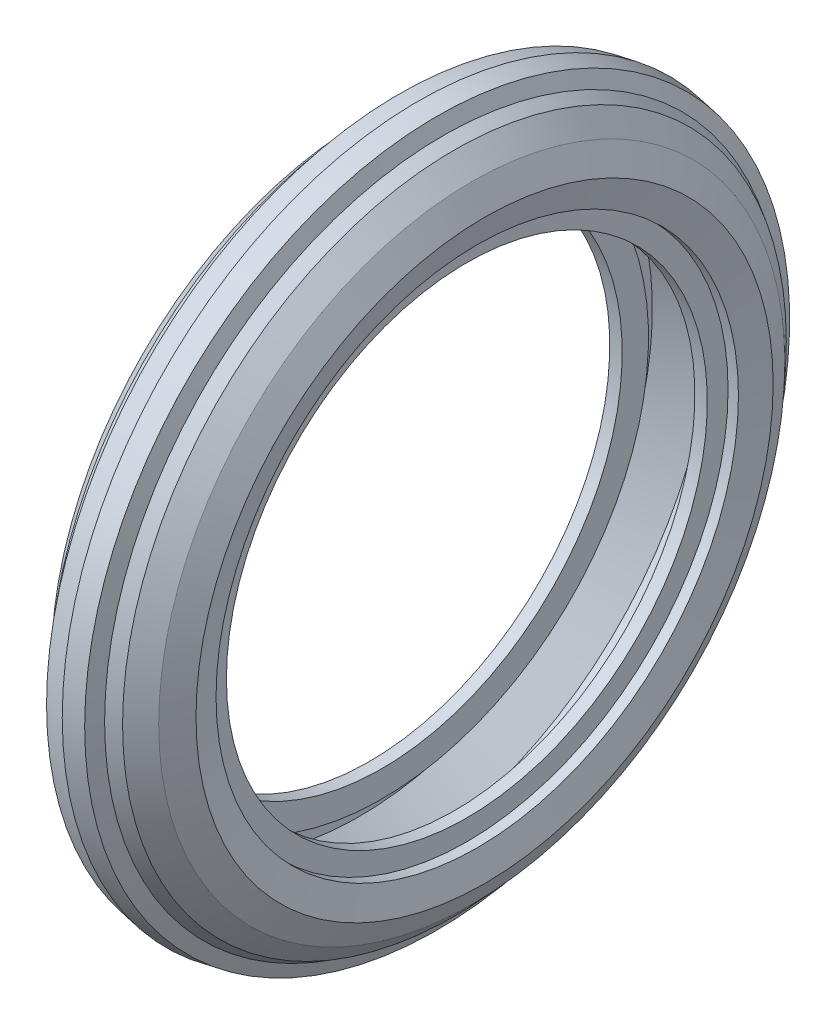
ISO-10303-21;
HEADER;
FILE_DESCRIPTION(('STEP AP214'),'2;1');
FILE_NAME('part.step','',(''),(''),'','','');
FILE_SCHEMA(('AUTOMOTIVE_DESIGN { 1 0 10303 214 1 1 1 1 }'));
ENDSEC;
DATA;
#1=APPLICATION_CONTEXT('core data for automotive mechanical design processes');
#2=APPLICATION_PROTOCOL_DEFINITION('international standard','automotive_design',2000,#1);
#3=PRODUCT_CONTEXT('',#1,'mechanical');
#4=PRODUCT('Part','Part','',(#3));
#5=PRODUCT_RELATED_PRODUCT_CATEGORY('part','',(#4));
#6=PRODUCT_DEFINITION_FORMATION('','',#4);
#7=PRODUCT_DEFINITION_CONTEXT('part definition',#1,'design');
#8=PRODUCT_DEFINITION('design','',#6,#7);
#9=PRODUCT_DEFINITION_SHAPE('','',#8);
#10=(LENGTH_UNIT() NAMED_UNIT(*) SI_UNIT(.MILLI.,.METRE.));
#11=(NAMED_UNIT(*) PLANE_ANGLE_UNIT() SI_UNIT($,.RADIAN.));
#12=(NAMED_UNIT(*) SI_UNIT($,.STERADIAN.) SOLID_ANGLE_UNIT());
#13=UNCERTAINTY_MEASURE_WITH_UNIT(LENGTH_MEASURE(1.E-05),#10,'distance_accuracy_value','');
#14=(GEOMETRIC_REPRESENTATION_CONTEXT(3) GLOBAL_UNCERTAINTY_ASSIGNED_CONTEXT((#13)) GLOBAL_UNIT_ASSIGNED_CONTEXT((#10,
#11,#12)) REPRESENTATION_CONTEXT('',''));
#15=CARTESIAN_POINT('',(0.,0.,0.));
#16=DIRECTION('',(0.,0.,1.));
#17=DIRECTION('',(1.,0.,0.));
#18=AXIS2_PLACEMENT_3D('',#15,#16,#17);
#19=CARTESIAN_POINT('',(-4.04774100981548,0.,0.));
#20=DIRECTION('',(1.,0.,0.));
#21=DIRECTION('',(0.,0.,-1.));
#22=AXIS2_PLACEMENT_3D('',#19,#20,#21);
#23=CONICAL_SURFACE('',#22,46.5793784236157,0.27008635387307);
#24=CARTESIAN_POINT('',(0.,0.,0.));
#25=DIRECTION('',(-1.,0.,0.));
#26=DIRECTION('',(0.,0.,1.));
#27=AXIS2_PLACEMENT_3D('',#24,#25,#26);
#28=CIRCLE('',#27,47.7);
#29=CARTESIAN_POINT('',(0.,0.,47.7));
#30=VERTEX_POINT('',#29);
#31=EDGE_CURVE('E140',#30,#30,#28,.T.);
#32=ORIENTED_EDGE('',*,*,#31,.F.);
#33=EDGE_LOOP('',(#32));
#34=FACE_BOUND('',#33,.T.);
#35=CARTESIAN_POINT('',(-4.04774100981548,0.,0.));
#36=DIRECTION('',(-1.,0.,0.));
#37=DIRECTION('',(0.,0.,1.));
#38=AXIS2_PLACEMENT_3D('',#35,#36,#37);
#39=CIRCLE('',#38,46.5793784236157);
#40=CARTESIAN_POINT('',(-4.04774100981548,0.,46.5793784236157));
#41=VERTEX_POINT('',#40);
#42=EDGE_CURVE('E10',#41,#41,#39,.T.);
#43=ORIENTED_EDGE('',*,*,#42,.T.);
#44=EDGE_LOOP('',(#43));
#45=FACE_BOUND('',#44,.T.);
#46=ADVANCED_FACE('F36',(#34,#45),#23,.F.);
#47=CARTESIAN_POINT('',(-8.49102763034936,0.,0.));
#48=DIRECTION('',(1.,0.,0.));
#49=DIRECTION('',(0.,0.,-1.));
#50=AXIS2_PLACEMENT_3D('',#47,#48,#49);
#51=CONICAL_SURFACE('',#50,42.4,0.754801377287533);
#52=ORIENTED_EDGE('',*,*,#42,.F.);
#53=EDGE_LOOP('',(#52));
#54=FACE_BOUND('',#53,.T.);
#55=CARTESIAN_POINT('',(-8.49102763034936,0.,0.));
#56=DIRECTION('',(-1.,0.,0.));
#57=DIRECTION('',(0.,0.,1.));
#58=AXIS2_PLACEMENT_3D('',#55,#56,#57);
#59=CIRCLE('',#58,42.4);
#60=CARTESIAN_POINT('',(-8.49102763034936,0.,42.4));
#61=VERTEX_POINT('',#60);
#62=EDGE_CURVE('E43',#61,#61,#59,.T.);
#63=ORIENTED_EDGE('',*,*,#62,.T.);
#64=EDGE_LOOP('',(#63));
#65=FACE_BOUND('',#64,.T.);
#66=ADVANCED_FACE('F148',(#54,#65),#51,.F.);
#67=CARTESIAN_POINT('',(-8.49102763034935,42.4,0.));
#68=DIRECTION('',(-1.,0.,0.));
#69=DIRECTION('',(0.,0.,1.));
#70=AXIS2_PLACEMENT_3D('',#67,#68,#69);
#71=PLANE('',#70);
#72=ORIENTED_EDGE('',*,*,#62,.F.);
#73=EDGE_LOOP('',(#72));
#74=FACE_BOUND('',#73,.T.);
#75=CARTESIAN_POINT('',(-8.49102763034934,0.,0.));
#76=DIRECTION('',(-1.,0.,0.));
#77=DIRECTION('',(0.,0.,1.));
#78=AXIS2_PLACEMENT_3D('',#75,#76,#77);
#79=CIRCLE('',#78,40.4);
#80=CARTESIAN_POINT('',(-8.49102763034934,0.,40.4));
#81=VERTEX_POINT('',#80);
#82=EDGE_CURVE('E50',#81,#81,#79,.T.);
#83=ORIENTED_EDGE('',*,*,#82,.T.);
#84=EDGE_LOOP('',(#83));
#85=FACE_BOUND('',#84,.T.);
#86=ADVANCED_FACE('F152',(#74,#85),#71,.F.);
#87=CARTESIAN_POINT('',(-5.25838165530042,0.,0.));
#88=DIRECTION('',(-1.,0.,0.));
#89=DIRECTION('',(0.,0.,1.));
#90=AXIS2_PLACEMENT_3D('',#87,#88,#89);
#91=CONICAL_SURFACE('',#90,38.6,0.508063755956606);
#92=ORIENTED_EDGE('',*,*,#82,.F.);
#93=EDGE_LOOP('',(#92));
#94=FACE_BOUND('',#93,.T.);
#95=CARTESIAN_POINT('',(-5.25838165530042,0.,0.));
#96=DIRECTION('',(-1.,0.,0.));
#97=DIRECTION('',(0.,0.,1.));
#98=AXIS2_PLACEMENT_3D('',#95,#96,#97);
#99=CIRCLE('',#98,38.6);
#100=CARTESIAN_POINT('',(-5.25838165530042,0.,38.6));
#101=VERTEX_POINT('',#100);
#102=EDGE_CURVE('E56',#101,#101,#99,.T.);
#103=ORIENTED_EDGE('',*,*,#102,.T.);
#104=EDGE_LOOP('',(#103));
#105=FACE_BOUND('',#104,.T.);
#106=ADVANCED_FACE('F157',(#94,#105),#91,.T.);
#107=CARTESIAN_POINT('',(-5.25838165530042,38.6,0.));
#108=DIRECTION('',(-1.,0.,0.));
#109=DIRECTION('',(0.,0.,1.));
#110=AXIS2_PLACEMENT_3D('',#107,#108,#109);
#111=PLANE('',#110);
#112=ORIENTED_EDGE('',*,*,#102,.F.);
#113=EDGE_LOOP('',(#112));
#114=FACE_BOUND('',#113,.T.);
#115=CARTESIAN_POINT('',(-5.25838165530043,0.,0.));
#116=DIRECTION('',(-1.,0.,0.));
#117=DIRECTION('',(0.,0.,1.));
#118=AXIS2_PLACEMENT_3D('',#115,#116,#117);
#119=CIRCLE('',#118,34.8);
#120=CARTESIAN_POINT('',(-5.25838165530043,0.,34.8));
#121=VERTEX_POINT('',#120);
#122=EDGE_CURVE('E61',#121,#121,#119,.T.);
#123=ORIENTED_EDGE('',*,*,#122,.T.);
#124=EDGE_LOOP('',(#123));
#125=FACE_BOUND('',#124,.T.);
#126=ADVANCED_FACE('F163',(#114,#125),#111,.F.);
#127=CARTESIAN_POINT('',(0.,0.,0.));
#128=DIRECTION('',(-1.,0.,0.));
#129=DIRECTION('',(0.,0.,1.));
#130=AXIS2_PLACEMENT_3D('',#127,#128,#129);
#131=CYLINDRICAL_SURFACE('',#130,34.8);
#132=ORIENTED_EDGE('',*,*,#122,.F.);
#133=EDGE_LOOP('',(#132));
#134=FACE_BOUND('',#133,.T.);
#135=CARTESIAN_POINT('',(-7.05838165530042,0.,0.));
#136=DIRECTION('',(-1.,0.,0.));
#137=DIRECTION('',(0.,0.,1.));
#138=AXIS2_PLACEMENT_3D('',#135,#136,#137);
#139=CIRCLE('',#138,34.8);
#140=CARTESIAN_POINT('',(-7.05838165530042,0.,34.8));
#141=VERTEX_POINT('',#140);
#142=EDGE_CURVE('E64',#141,#141,#139,.T.);
#143=ORIENTED_EDGE('',*,*,#142,.T.);
#144=EDGE_LOOP('',(#143));
#145=FACE_BOUND('',#144,.T.);
#146=ADVANCED_FACE('F167',(#134,#145),#131,.F.);
#147=CARTESIAN_POINT('',(-7.05838165530042,34.8,0.));
#148=DIRECTION('',(1.,0.,0.));
#149=DIRECTION('',(0.,0.,-1.));
#150=AXIS2_PLACEMENT_3D('',#147,#148,#149);
#151=PLANE('',#150);
#152=ORIENTED_EDGE('',*,*,#142,.F.);
#153=EDGE_LOOP('',(#152));
#154=FACE_BOUND('',#153,.T.);
#155=CARTESIAN_POINT('',(-7.05838165530042,0.,0.));
#156=DIRECTION('',(-1.,0.,0.));
#157=DIRECTION('',(0.,0.,1.));
#158=AXIS2_PLACEMENT_3D('',#155,#156,#157);
#159=CIRCLE('',#158,37.8);
#160=CARTESIAN_POINT('',(-7.05838165530042,0.,37.8));
#161=VERTEX_POINT('',#160);
#162=EDGE_CURVE('E67',#161,#161,#159,.T.);
#163=ORIENTED_EDGE('',*,*,#162,.T.);
#164=EDGE_LOOP('',(#163));
#165=FACE_BOUND('',#164,.T.);
#166=ADVANCED_FACE('F171',(#154,#165),#151,.F.);
#167=CARTESIAN_POINT('',(0.,0.,0.));
#168=DIRECTION('',(-1.,0.,0.));
#169=DIRECTION('',(0.,0.,1.));
#170=AXIS2_PLACEMENT_3D('',#167,#168,#169);
#171=CYLINDRICAL_SURFACE('',#170,37.8);
#172=ORIENTED_EDGE('',*,*,#162,.F.);
#173=EDGE_LOOP('',(#172));
#174=FACE_BOUND('',#173,.T.);
#175=CARTESIAN_POINT('',(-8.55838165530042,0.,0.));
#176=DIRECTION('',(-1.,0.,0.));
#177=DIRECTION('',(0.,0.,1.));
#178=AXIS2_PLACEMENT_3D('',#175,#176,#177);
#179=CIRCLE('',#178,37.8);
#180=CARTESIAN_POINT('',(-8.55838165530042,0.,37.8));
#181=VERTEX_POINT('',#180);
#182=EDGE_CURVE('E70',#181,#181,#179,.T.);
#183=ORIENTED_EDGE('',*,*,#182,.T.);
#184=EDGE_LOOP('',(#183));
#185=FACE_BOUND('',#184,.T.);
#186=ADVANCED_FACE('F175',(#174,#185),#171,.F.);
#187=CARTESIAN_POINT('',(-9.61933982850798,0.,0.));
#188=DIRECTION('',(-1.,0.,0.));
#189=DIRECTION('',(0.,0.,1.));
#190=AXIS2_PLACEMENT_3D('',#187,#188,#189);
#191=CONICAL_SURFACE('',#190,41.7603494485593,1.30904741763839);
#192=ORIENTED_EDGE('',*,*,#182,.F.);
#193=EDGE_LOOP('',(#192));
#194=FACE_BOUND('',#193,.T.);
#195=CARTESIAN_POINT('',(-9.61933982850798,0.,0.));
#196=DIRECTION('',(-1.,0.,0.));
#197=DIRECTION('',(0.,0.,1.));
#198=AXIS2_PLACEMENT_3D('',#195,#196,#197);
#199=CIRCLE('',#198,41.7603494485593);
#200=CARTESIAN_POINT('',(-9.61933982850798,0.,41.7603494485593));
#201=VERTEX_POINT('',#200);
#202=EDGE_CURVE('E73',#201,#201,#199,.T.);
#203=ORIENTED_EDGE('',*,*,#202,.T.);
#204=EDGE_LOOP('',(#203));
#205=FACE_BOUND('',#204,.T.);
#206=ADVANCED_FACE('F179',(#194,#205),#191,.F.);
#207=CARTESIAN_POINT('',(-7.76051889287042,0.,0.));
#208=DIRECTION('',(1.,0.,0.));
#209=DIRECTION('',(0.,0.,-1.));
#210=AXIS2_PLACEMENT_3D('',#207,#208,#209);
#211=CONICAL_SURFACE('',#210,45.3022112088819,1.08749463862053);
#212=ORIENTED_EDGE('',*,*,#202,.F.);
#213=EDGE_LOOP('',(#212));
#214=FACE_BOUND('',#213,.T.);
#215=CARTESIAN_POINT('',(-7.76051889287042,0.,0.));
#216=DIRECTION('',(-1.,0.,0.));
#217=DIRECTION('',(0.,0.,1.));
#218=AXIS2_PLACEMENT_3D('',#215,#216,#217);
#219=CIRCLE('',#218,45.3022112088819);
#220=CARTESIAN_POINT('',(-7.76051889287042,0.,45.3022112088819));
#221=VERTEX_POINT('',#220);
#222=EDGE_CURVE('E76',#221,#221,#219,.T.);
#223=ORIENTED_EDGE('',*,*,#222,.T.);
#224=EDGE_LOOP('',(#223));
#225=FACE_BOUND('',#224,.T.);
#226=ADVANCED_FACE('F183',(#214,#225),#211,.T.);
#227=CARTESIAN_POINT('',(-5.25838165530043,0.,0.));
#228=DIRECTION('',(1.,0.,0.));
#229=DIRECTION('',(0.,0.,-1.));
#230=AXIS2_PLACEMENT_3D('',#227,#228,#229);
#231=CONICAL_SURFACE('',#230,48.0278871331924,0.828131633697217);
#232=ORIENTED_EDGE('',*,*,#222,.F.);
#233=EDGE_LOOP('',(#232));
#234=FACE_BOUND('',#233,.T.);
#235=CARTESIAN_POINT('',(-5.25838165530043,0.,0.));
#236=DIRECTION('',(-1.,0.,0.));
#237=DIRECTION('',(0.,0.,1.));
#238=AXIS2_PLACEMENT_3D('',#235,#236,#237);
#239=CIRCLE('',#238,48.0278871331924);
#240=CARTESIAN_POINT('',(-5.25838165530043,0.,48.0278871331924));
#241=VERTEX_POINT('',#240);
#242=EDGE_CURVE('E80',#241,#241,#239,.T.);
#243=ORIENTED_EDGE('',*,*,#242,.T.);
#244=EDGE_LOOP('',(#243));
#245=FACE_BOUND('',#244,.T.);
#246=ADVANCED_FACE('F187',(#234,#245),#231,.T.);
#247=CARTESIAN_POINT('',(-3.61929083035339,0.,0.));
#248=DIRECTION('',(1.,0.,0.));
#249=DIRECTION('',(0.,0.,-1.));
#250=AXIS2_PLACEMENT_3D('',#247,#248,#249);
#251=CONICAL_SURFACE('',#250,48.988814428868,0.530252528258391);
#252=ORIENTED_EDGE('',*,*,#242,.F.);
#253=EDGE_LOOP('',(#252));
#254=FACE_BOUND('',#253,.T.);
#255=CARTESIAN_POINT('',(-3.61929083035339,0.,0.));
#256=DIRECTION('',(-1.,0.,0.));
#257=DIRECTION('',(0.,0.,1.));
#258=AXIS2_PLACEMENT_3D('',#255,#256,#257);
#259=CIRCLE('',#258,48.988814428868);
#260=CARTESIAN_POINT('',(-3.61929083035339,0.,48.988814428868));
#261=VERTEX_POINT('',#260);
#262=EDGE_CURVE('E84',#261,#261,#259,.T.);
#263=ORIENTED_EDGE('',*,*,#262,.T.);
#264=EDGE_LOOP('',(#263));
#265=FACE_BOUND('',#264,.T.);
#266=ADVANCED_FACE('F191',(#254,#265),#251,.T.);
#267=CARTESIAN_POINT('',(-2.75730827300353,0.,0.));
#268=DIRECTION('',(1.,0.,0.));
#269=DIRECTION('',(0.,0.,-1.));
#270=AXIS2_PLACEMENT_3D('',#267,#268,#269);
#271=CONICAL_SURFACE('',#270,51.0129157284142,1.16819798825675);
#272=ORIENTED_EDGE('',*,*,#262,.F.);
#273=EDGE_LOOP('',(#272));
#274=FACE_BOUND('',#273,.T.);
#275=CARTESIAN_POINT('',(-2.75730827300353,0.,0.));
#276=DIRECTION('',(-1.,0.,0.));
#277=DIRECTION('',(0.,0.,1.));
#278=AXIS2_PLACEMENT_3D('',#275,#276,#277);
#279=CIRCLE('',#278,51.0129157284142);
#280=CARTESIAN_POINT('',(-2.75730827300353,0.,51.0129157284142));
#281=VERTEX_POINT('',#280);
#282=EDGE_CURVE('E87',#281,#281,#279,.T.);
#283=ORIENTED_EDGE('',*,*,#282,.T.);
#284=EDGE_LOOP('',(#283));
#285=FACE_BOUND('',#284,.T.);
#286=ADVANCED_FACE('F195',(#274,#285),#271,.T.);
#287=CARTESIAN_POINT('',(0.,0.,0.));
#288=DIRECTION('',(1.,0.,0.));
#289=DIRECTION('',(0.,0.,-1.));
#290=AXIS2_PLACEMENT_3D('',#287,#288,#289);
#291=CONICAL_SURFACE('',#290,51.5,0.174848214545736);
#292=ORIENTED_EDGE('',*,*,#282,.F.);
#293=EDGE_LOOP('',(#292));
#294=FACE_BOUND('',#293,.T.);
#295=CARTESIAN_POINT('',(0.,0.,0.));
#296=DIRECTION('',(-1.,0.,0.));
#297=DIRECTION('',(0.,0.,1.));
#298=AXIS2_PLACEMENT_3D('',#295,#296,#297);
#299=CIRCLE('',#298,51.5);
#300=CARTESIAN_POINT('',(0.,0.,51.5));
#301=VERTEX_POINT('',#300);
#302=EDGE_CURVE('E91',#301,#301,#299,.T.);
#303=ORIENTED_EDGE('',*,*,#302,.T.);
#304=EDGE_LOOP('',(#303));
#305=FACE_BOUND('',#304,.T.);
#306=ADVANCED_FACE('F199',(#294,#305),#291,.T.);
#307=CARTESIAN_POINT('',(2.75730827300353,0.,0.));
#308=DIRECTION('',(-1.,0.,0.));
#309=DIRECTION('',(0.,0.,1.));
#310=AXIS2_PLACEMENT_3D('',#307,#308,#309);
#311=CONICAL_SURFACE('',#310,51.0129157284142,0.174848214545736);
#312=ORIENTED_EDGE('',*,*,#302,.F.);
#313=EDGE_LOOP('',(#312));
#314=FACE_BOUND('',#313,.T.);
#315=CARTESIAN_POINT('',(2.75730827300353,0.,0.));
#316=DIRECTION('',(-1.,0.,0.));
#317=DIRECTION('',(0.,0.,1.));
#318=AXIS2_PLACEMENT_3D('',#315,#316,#317);
#319=CIRCLE('',#318,51.0129157284142);
#320=CARTESIAN_POINT('',(2.75730827300353,0.,51.0129157284142));
#321=VERTEX_POINT('',#320);
#322=EDGE_CURVE('E95',#321,#321,#319,.T.);
#323=ORIENTED_EDGE('',*,*,#322,.T.);
#324=EDGE_LOOP('',(#323));
#325=FACE_BOUND('',#324,.T.);
#326=ADVANCED_FACE('F203',(#314,#325),#311,.T.);
#327=CARTESIAN_POINT('',(3.61929083035339,0.,0.));
#328=DIRECTION('',(-1.,0.,0.));
#329=DIRECTION('',(0.,0.,1.));
#330=AXIS2_PLACEMENT_3D('',#327,#328,#329);
#331=CONICAL_SURFACE('',#330,48.988814428868,1.16819798825675);
#332=ORIENTED_EDGE('',*,*,#322,.F.);
#333=EDGE_LOOP('',(#332));
#334=FACE_BOUND('',#333,.T.);
#335=CARTESIAN_POINT('',(3.61929083035339,0.,0.));
#336=DIRECTION('',(-1.,0.,0.));
#337=DIRECTION('',(0.,0.,1.));
#338=AXIS2_PLACEMENT_3D('',#335,#336,#337);
#339=CIRCLE('',#338,48.988814428868);
#340=CARTESIAN_POINT('',(3.61929083035339,0.,48.988814428868));
#341=VERTEX_POINT('',#340);
#342=EDGE_CURVE('E99',#341,#341,#339,.T.);
#343=ORIENTED_EDGE('',*,*,#342,.T.);
#344=EDGE_LOOP('',(#343));
#345=FACE_BOUND('',#344,.T.);
#346=ADVANCED_FACE('F207',(#334,#345),#331,.T.);
#347=CARTESIAN_POINT('',(5.25838165530043,0.,0.));
#348=DIRECTION('',(-1.,0.,0.));
#349=DIRECTION('',(0.,0.,1.));
#350=AXIS2_PLACEMENT_3D('',#347,#348,#349);
#351=CONICAL_SURFACE('',#350,48.0278871331924,0.530252528258391);
#352=ORIENTED_EDGE('',*,*,#342,.F.);
#353=EDGE_LOOP('',(#352));
#354=FACE_BOUND('',#353,.T.);
#355=CARTESIAN_POINT('',(5.25838165530043,0.,0.));
#356=DIRECTION('',(-1.,0.,0.));
#357=DIRECTION('',(0.,0.,1.));
#358=AXIS2_PLACEMENT_3D('',#355,#356,#357);
#359=CIRCLE('',#358,48.0278871331924);
#360=CARTESIAN_POINT('',(5.25838165530043,0.,48.0278871331924));
#361=VERTEX_POINT('',#360);
#362=EDGE_CURVE('E103',#361,#361,#359,.T.);
#363=ORIENTED_EDGE('',*,*,#362,.T.);
#364=EDGE_LOOP('',(#363));
#365=FACE_BOUND('',#364,.T.);
#366=ADVANCED_FACE('F211',(#354,#365),#351,.T.);
#367=CARTESIAN_POINT('',(7.76051889287042,0.,0.));
#368=DIRECTION('',(-1.,0.,0.));
#369=DIRECTION('',(0.,0.,1.));
#370=AXIS2_PLACEMENT_3D('',#367,#368,#369);
#371=CONICAL_SURFACE('',#370,45.3022112088819,0.828131633697217);
#372=ORIENTED_EDGE('',*,*,#362,.F.);
#373=EDGE_LOOP('',(#372));
#374=FACE_BOUND('',#373,.T.);
#375=CARTESIAN_POINT('',(7.76051889287042,0.,0.));
#376=DIRECTION('',(-1.,0.,0.));
#377=DIRECTION('',(0.,0.,1.));
#378=AXIS2_PLACEMENT_3D('',#375,#376,#377);
#379=CIRCLE('',#378,45.3022112088819);
#380=CARTESIAN_POINT('',(7.76051889287042,0.,45.3022112088819));
#381=VERTEX_POINT('',#380);
#382=EDGE_CURVE('E107',#381,#381,#379,.T.);
#383=ORIENTED_EDGE('',*,*,#382,.T.);
#384=EDGE_LOOP('',(#383));
#385=FACE_BOUND('',#384,.T.);
#386=ADVANCED_FACE('F215',(#374,#385),#371,.T.);
#387=CARTESIAN_POINT('',(9.61933982850798,0.,0.));
#388=DIRECTION('',(-1.,0.,0.));
#389=DIRECTION('',(0.,0.,1.));
#390=AXIS2_PLACEMENT_3D('',#387,#388,#389);
#391=CONICAL_SURFACE('',#390,41.7603494485593,1.08749463862053);
#392=ORIENTED_EDGE('',*,*,#382,.F.);
#393=EDGE_LOOP('',(#392));
#394=FACE_BOUND('',#393,.T.);
#395=CARTESIAN_POINT('',(9.61933982850798,0.,0.));
#396=DIRECTION('',(-1.,0.,0.));
#397=DIRECTION('',(0.,0.,1.));
#398=AXIS2_PLACEMENT_3D('',#395,#396,#397);
#399=CIRCLE('',#398,41.7603494485593);
#400=CARTESIAN_POINT('',(9.61933982850798,0.,41.7603494485593));
#401=VERTEX_POINT('',#400);
#402=EDGE_CURVE('E110',#401,#401,#399,.T.);
#403=ORIENTED_EDGE('',*,*,#402,.T.);
#404=EDGE_LOOP('',(#403));
#405=FACE_BOUND('',#404,.T.);
#406=ADVANCED_FACE('F219',(#394,#405),#391,.T.);
#407=CARTESIAN_POINT('',(8.55838165530042,0.,0.));
#408=DIRECTION('',(1.,0.,0.));
#409=DIRECTION('',(0.,0.,-1.));
#410=AXIS2_PLACEMENT_3D('',#407,#408,#409);
#411=CONICAL_SURFACE('',#410,37.8,1.30904741763839);
#412=ORIENTED_EDGE('',*,*,#402,.F.);
#413=EDGE_LOOP('',(#412));
#414=FACE_BOUND('',#413,.T.);
#415=CARTESIAN_POINT('',(8.55838165530042,0.,0.));
#416=DIRECTION('',(-1.,0.,0.));
#417=DIRECTION('',(0.,0.,1.));
#418=AXIS2_PLACEMENT_3D('',#415,#416,#417);
#419=CIRCLE('',#418,37.8);
#420=CARTESIAN_POINT('',(8.55838165530042,0.,37.8));
#421=VERTEX_POINT('',#420);
#422=EDGE_CURVE('E114',#421,#421,#419,.T.);
#423=ORIENTED_EDGE('',*,*,#422,.T.);
#424=EDGE_LOOP('',(#423));
#425=FACE_BOUND('',#424,.T.);
#426=ADVANCED_FACE('F223',(#414,#425),#411,.F.);
#427=CARTESIAN_POINT('',(0.,0.,0.));
#428=DIRECTION('',(-1.,0.,0.));
#429=DIRECTION('',(0.,0.,1.));
#430=AXIS2_PLACEMENT_3D('',#427,#428,#429);
#431=CYLINDRICAL_SURFACE('',#430,37.8);
#432=ORIENTED_EDGE('',*,*,#422,.F.);
#433=EDGE_LOOP('',(#432));
#434=FACE_BOUND('',#433,.T.);
#435=CARTESIAN_POINT('',(7.05838165530042,0.,0.));
#436=DIRECTION('',(-1.,0.,0.));
#437=DIRECTION('',(0.,0.,1.));
#438=AXIS2_PLACEMENT_3D('',#435,#436,#437);
#439=CIRCLE('',#438,37.8);
#440=CARTESIAN_POINT('',(7.05838165530042,0.,37.8));
#441=VERTEX_POINT('',#440);
#442=EDGE_CURVE('E117',#441,#441,#439,.T.);
#443=ORIENTED_EDGE('',*,*,#442,.T.);
#444=EDGE_LOOP('',(#443));
#445=FACE_BOUND('',#444,.T.);
#446=ADVANCED_FACE('F227',(#434,#445),#431,.F.);
#447=CARTESIAN_POINT('',(7.05838165530042,34.8,0.));
#448=DIRECTION('',(-1.,0.,0.));
#449=DIRECTION('',(0.,0.,1.));
#450=AXIS2_PLACEMENT_3D('',#447,#448,#449);
#451=PLANE('',#450);
#452=ORIENTED_EDGE('',*,*,#442,.F.);
#453=EDGE_LOOP('',(#452));
#454=FACE_BOUND('',#453,.T.);
#455=CARTESIAN_POINT('',(7.05838165530042,0.,0.));
#456=DIRECTION('',(-1.,0.,0.));
#457=DIRECTION('',(0.,0.,1.));
#458=AXIS2_PLACEMENT_3D('',#455,#456,#457);
#459=CIRCLE('',#458,34.8);
#460=CARTESIAN_POINT('',(7.05838165530042,0.,34.8));
#461=VERTEX_POINT('',#460);
#462=EDGE_CURVE('E120',#461,#461,#459,.T.);
#463=ORIENTED_EDGE('',*,*,#462,.T.);
#464=EDGE_LOOP('',(#463));
#465=FACE_BOUND('',#464,.T.);
#466=ADVANCED_FACE('F231',(#454,#465),#451,.F.);
#467=CARTESIAN_POINT('',(0.,0.,0.));
#468=DIRECTION('',(-1.,0.,0.));
#469=DIRECTION('',(0.,0.,1.));
#470=AXIS2_PLACEMENT_3D('',#467,#468,#469);
#471=CYLINDRICAL_SURFACE('',#470,34.8);
#472=ORIENTED_EDGE('',*,*,#462,.F.);
#473=EDGE_LOOP('',(#472));
#474=FACE_BOUND('',#473,.T.);
#475=CARTESIAN_POINT('',(5.25838165530042,0.,0.));
#476=DIRECTION('',(-1.,0.,0.));
#477=DIRECTION('',(0.,0.,1.));
#478=AXIS2_PLACEMENT_3D('',#475,#476,#477);
#479=CIRCLE('',#478,34.8);
#480=CARTESIAN_POINT('',(5.25838165530042,0.,34.8));
#481=VERTEX_POINT('',#480);
#482=EDGE_CURVE('E123',#481,#481,#479,.T.);
#483=ORIENTED_EDGE('',*,*,#482,.T.);
#484=EDGE_LOOP('',(#483));
#485=FACE_BOUND('',#484,.T.);
#486=ADVANCED_FACE('F235',(#474,#485),#471,.F.);
#487=CARTESIAN_POINT('',(5.25838165530042,38.6,0.));
#488=DIRECTION('',(1.,0.,0.));
#489=DIRECTION('',(0.,0.,-1.));
#490=AXIS2_PLACEMENT_3D('',#487,#488,#489);
#491=PLANE('',#490);
#492=ORIENTED_EDGE('',*,*,#482,.F.);
#493=EDGE_LOOP('',(#492));
#494=FACE_BOUND('',#493,.T.);
#495=CARTESIAN_POINT('',(5.25838165530042,0.,0.));
#496=DIRECTION('',(-1.,0.,0.));
#497=DIRECTION('',(0.,0.,1.));
#498=AXIS2_PLACEMENT_3D('',#495,#496,#497);
#499=CIRCLE('',#498,38.6);
#500=CARTESIAN_POINT('',(5.25838165530042,0.,38.6));
#501=VERTEX_POINT('',#500);
#502=EDGE_CURVE('E126',#501,#501,#499,.T.);
#503=ORIENTED_EDGE('',*,*,#502,.T.);
#504=EDGE_LOOP('',(#503));
#505=FACE_BOUND('',#504,.T.);
#506=ADVANCED_FACE('F239',(#494,#505),#491,.F.);
#507=CARTESIAN_POINT('',(8.49102763034934,0.,0.));
#508=DIRECTION('',(1.,0.,0.));
#509=DIRECTION('',(0.,0.,-1.));
#510=AXIS2_PLACEMENT_3D('',#507,#508,#509);
#511=CONICAL_SURFACE('',#510,40.4,0.508063755956606);
#512=ORIENTED_EDGE('',*,*,#502,.F.);
#513=EDGE_LOOP('',(#512));
#514=FACE_BOUND('',#513,.T.);
#515=CARTESIAN_POINT('',(8.49102763034934,0.,0.));
#516=DIRECTION('',(-1.,0.,0.));
#517=DIRECTION('',(0.,0.,1.));
#518=AXIS2_PLACEMENT_3D('',#515,#516,#517);
#519=CIRCLE('',#518,40.4);
#520=CARTESIAN_POINT('',(8.49102763034934,0.,40.4));
#521=VERTEX_POINT('',#520);
#522=EDGE_CURVE('E129',#521,#521,#519,.T.);
#523=ORIENTED_EDGE('',*,*,#522,.T.);
#524=EDGE_LOOP('',(#523));
#525=FACE_BOUND('',#524,.T.);
#526=ADVANCED_FACE('F243',(#514,#525),#511,.T.);
#527=CARTESIAN_POINT('',(8.49102763034934,42.4,0.));
#528=DIRECTION('',(1.,0.,0.));
#529=DIRECTION('',(0.,0.,-1.));
#530=AXIS2_PLACEMENT_3D('',#527,#528,#529);
#531=PLANE('',#530);
#532=ORIENTED_EDGE('',*,*,#522,.F.);
#533=EDGE_LOOP('',(#532));
#534=FACE_BOUND('',#533,.T.);
#535=CARTESIAN_POINT('',(8.49102763034934,0.,0.));
#536=DIRECTION('',(-1.,0.,0.));
#537=DIRECTION('',(0.,0.,1.));
#538=AXIS2_PLACEMENT_3D('',#535,#536,#537);
#539=CIRCLE('',#538,42.4);
#540=CARTESIAN_POINT('',(8.49102763034934,0.,42.4));
#541=VERTEX_POINT('',#540);
#542=EDGE_CURVE('E132',#541,#541,#539,.T.);
#543=ORIENTED_EDGE('',*,*,#542,.T.);
#544=EDGE_LOOP('',(#543));
#545=FACE_BOUND('',#544,.T.);
#546=ADVANCED_FACE('F247',(#534,#545),#531,.F.);
#547=CARTESIAN_POINT('',(4.04774100981548,0.,0.));
#548=DIRECTION('',(-1.,0.,0.));
#549=DIRECTION('',(0.,0.,1.));
#550=AXIS2_PLACEMENT_3D('',#547,#548,#549);
#551=CONICAL_SURFACE('',#550,46.5793784236157,0.754801377287534);
#552=ORIENTED_EDGE('',*,*,#542,.F.);
#553=EDGE_LOOP('',(#552));
#554=FACE_BOUND('',#553,.T.);
#555=CARTESIAN_POINT('',(4.04774100981548,0.,0.));
#556=DIRECTION('',(-1.,0.,0.));
#557=DIRECTION('',(0.,0.,1.));
#558=AXIS2_PLACEMENT_3D('',#555,#556,#557);
#559=CIRCLE('',#558,46.5793784236157);
#560=CARTESIAN_POINT('',(4.04774100981548,0.,46.5793784236157));
#561=VERTEX_POINT('',#560);
#562=EDGE_CURVE('E136',#561,#561,#559,.T.);
#563=ORIENTED_EDGE('',*,*,#562,.T.);
#564=EDGE_LOOP('',(#563));
#565=FACE_BOUND('',#564,.T.);
#566=ADVANCED_FACE('F251',(#554,#565),#551,.F.);
#567=CARTESIAN_POINT('',(0.,0.,0.));
#568=DIRECTION('',(-1.,0.,0.));
#569=DIRECTION('',(0.,0.,1.));
#570=AXIS2_PLACEMENT_3D('',#567,#568,#569);
#571=CONICAL_SURFACE('',#570,47.7,0.27008635387307);
#572=ORIENTED_EDGE('',*,*,#562,.F.);
#573=EDGE_LOOP('',(#572));
#574=FACE_BOUND('',#573,.T.);
#575=ORIENTED_EDGE('',*,*,#31,.T.);
#576=EDGE_LOOP('',(#575));
#577=FACE_BOUND('',#576,.T.);
#578=ADVANCED_FACE('F145',(#574,#577),#571,.F.);
#579=CLOSED_SHELL('',(#46,#66,#86,#106,#126,#146,#166,#186,#206,#226,#246,#266,#286,#306,#326,
#346,#366,#386,#406,#426,#446,#466,#486,#506,#526,#546,#566,#578));
#580=MANIFOLD_SOLID_BREP('B2',#579);
#581=ADVANCED_BREP_SHAPE_REPRESENTATION('',(#18,#580),#14);
#582=SHAPE_DEFINITION_REPRESENTATION(#9,#581);
ENDSEC;
END-ISO-10303-21;
